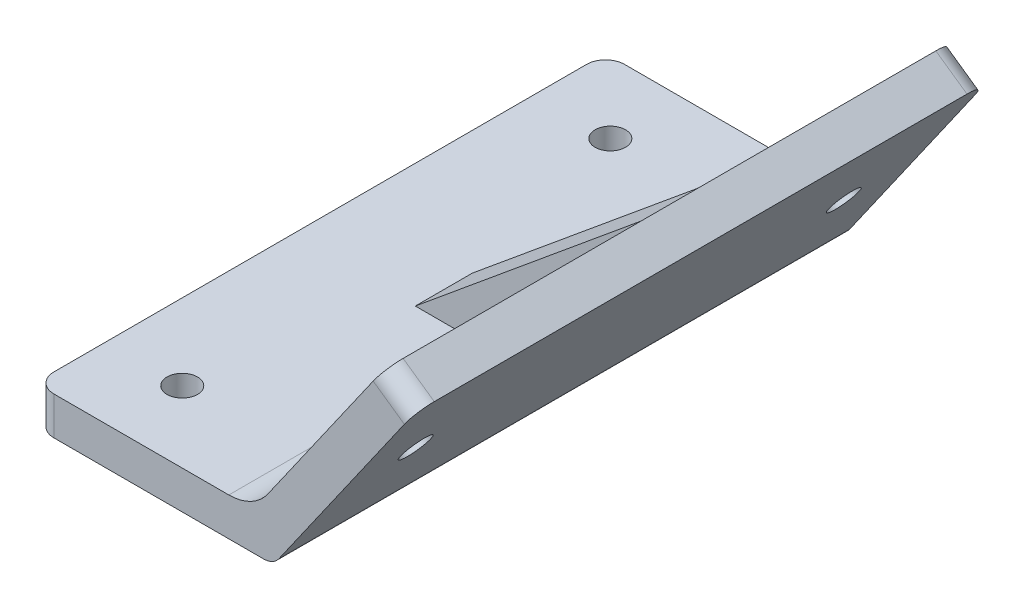
ISO-10303-21;
HEADER;
FILE_DESCRIPTION(('STEP AP214'),'2;1');
FILE_NAME('part.step','',(''),(''),'','','');
FILE_SCHEMA(('AUTOMOTIVE_DESIGN { 1 0 10303 214 1 1 1 1 }'));
ENDSEC;
DATA;
#1=APPLICATION_CONTEXT('core data for automotive mechanical design processes');
#2=APPLICATION_PROTOCOL_DEFINITION('international standard','automotive_design',2000,#1);
#3=PRODUCT_CONTEXT('',#1,'mechanical');
#4=PRODUCT('Part','Part','',(#3));
#5=PRODUCT_RELATED_PRODUCT_CATEGORY('part','',(#4));
#6=PRODUCT_DEFINITION_FORMATION('','',#4);
#7=PRODUCT_DEFINITION_CONTEXT('part definition',#1,'design');
#8=PRODUCT_DEFINITION('design','',#6,#7);
#9=PRODUCT_DEFINITION_SHAPE('','',#8);
#10=(LENGTH_UNIT() NAMED_UNIT(*) SI_UNIT(.MILLI.,.METRE.));
#11=(NAMED_UNIT(*) PLANE_ANGLE_UNIT() SI_UNIT($,.RADIAN.));
#12=(NAMED_UNIT(*) SI_UNIT($,.STERADIAN.) SOLID_ANGLE_UNIT());
#13=UNCERTAINTY_MEASURE_WITH_UNIT(LENGTH_MEASURE(1.E-05),#10,'distance_accuracy_value','');
#14=(GEOMETRIC_REPRESENTATION_CONTEXT(3) GLOBAL_UNCERTAINTY_ASSIGNED_CONTEXT((#13)) GLOBAL_UNIT_ASSIGNED_CONTEXT((#10,
#11,#12)) REPRESENTATION_CONTEXT('',''));
#15=CARTESIAN_POINT('',(0.,0.,0.));
#16=DIRECTION('',(0.,0.,1.));
#17=DIRECTION('',(1.,0.,0.));
#18=AXIS2_PLACEMENT_3D('',#15,#16,#17);
#19=CARTESIAN_POINT('',(6.07831173554464,-4.25607969681687,30.));
#20=DIRECTION('',(0.819152044288993,-0.573576436351044,0.));
#21=DIRECTION('',(0.573576436351044,0.819152044288993,0.));
#22=AXIS2_PLACEMENT_3D('',#19,#20,#21);
#23=PLANE('',#22);
#24=CARTESIAN_POINT('',(16.7210195965111,10.9432823211611,-22.5));
#25=DIRECTION('',(0.819152044288993,-0.573576436351044,0.));
#26=DIRECTION('',(0.573576436351044,0.819152044288993,0.));
#27=AXIS2_PLACEMENT_3D('',#24,#25,#26);
#28=CIRCLE('',#27,1.6);
#29=CARTESIAN_POINT('',(17.6387418946728,12.2539255920235,-22.5));
#30=VERTEX_POINT('',#29);
#31=EDGE_CURVE('E535',#30,#30,#28,.T.);
#32=ORIENTED_EDGE('',*,*,#31,.T.);
#33=EDGE_LOOP('',(#32));
#34=FACE_BOUND('',#33,.T.);
#35=DIRECTION('',(0.,0.,-1.));
#36=VECTOR('',#35,1.);
#37=CARTESIAN_POINT('',(24.1775132690747,21.592258896918,30.));
#38=LINE('',#37,#36);
#39=CARTESIAN_POINT('',(24.1775132690747,21.592258896918,-3.));
#40=VERTEX_POINT('',#39);
#41=CARTESIAN_POINT('',(24.1775132690747,21.592258896918,-28.));
#42=VERTEX_POINT('',#41);
#43=EDGE_CURVE('E213',#40,#42,#38,.T.);
#44=ORIENTED_EDGE('',*,*,#43,.T.);
#45=CARTESIAN_POINT('',(23.0303603963726,19.95395480834,-28.));
#46=DIRECTION('',(0.819152044288993,-0.573576436351044,0.));
#47=DIRECTION('',(0.573576436351044,0.819152044288993,0.));
#48=AXIS2_PLACEMENT_3D('',#45,#46,#47);
#49=CIRCLE('',#48,2.);
#50=CARTESIAN_POINT('',(23.0303603963726,19.95395480834,-30.));
#51=VERTEX_POINT('',#50);
#52=EDGE_CURVE('E240',#42,#51,#49,.F.);
#53=ORIENTED_EDGE('',*,*,#52,.T.);
#54=DIRECTION('',(-0.573576436351044,-0.819152044288993,0.));
#55=VECTOR('',#54,1.);
#56=CARTESIAN_POINT('',(6.07831173554464,-4.25607969681687,-30.));
#57=LINE('',#56,#55);
#58=CARTESIAN_POINT('',(11.9517908675827,4.13211781824478,-30.));
#59=VERTEX_POINT('',#58);
#60=EDGE_CURVE('E169',#51,#59,#57,.T.);
#61=ORIENTED_EDGE('',*,*,#60,.T.);
#62=DIRECTION('',(0.,0.,-1.));
#63=VECTOR('',#62,1.);
#64=CARTESIAN_POINT('',(11.9517908675827,4.13211781824478,30.));
#65=LINE('',#64,#63);
#66=CARTESIAN_POINT('',(11.9517908675827,4.13211781824478,-3.));
#67=VERTEX_POINT('',#66);
#68=EDGE_CURVE('E225',#59,#67,#65,.F.);
#69=ORIENTED_EDGE('',*,*,#68,.T.);
#70=DIRECTION('',(-0.573576436351043,-0.819152044288994,0.));
#71=VECTOR('',#70,1.);
#72=CARTESIAN_POINT('',(6.07831173554464,-4.25607969681687,-3.));
#73=LINE('',#72,#71);
#74=EDGE_CURVE('E158',#40,#67,#73,.T.);
#75=ORIENTED_EDGE('',*,*,#74,.F.);
#76=EDGE_LOOP('',(#44,#53,#61,#69,#75));
#77=FACE_BOUND('',#76,.T.);
#78=ADVANCED_FACE('F34',(#34,#77),#23,.F.);
#79=CARTESIAN_POINT('',(0.,2.,30.));
#80=DIRECTION('',(0.,1.,0.));
#81=DIRECTION('',(0.,0.,1.));
#82=AXIS2_PLACEMENT_3D('',#79,#80,#81);
#83=PLANE('',#82);
#84=CARTESIAN_POINT('',(-4.54113410110349,2.,22.5));
#85=DIRECTION('',(0.,1.,0.));
#86=DIRECTION('',(0.,0.,1.));
#87=AXIS2_PLACEMENT_3D('',#84,#85,#86);
#88=CIRCLE('',#87,1.6);
#89=CARTESIAN_POINT('',(-4.54113410110349,2.,24.1));
#90=VERTEX_POINT('',#89);
#91=EDGE_CURVE('E549',#90,#90,#88,.T.);
#92=ORIENTED_EDGE('',*,*,#91,.F.);
#93=EDGE_LOOP('',(#92));
#94=FACE_BOUND('',#93,.T.);
#95=CARTESIAN_POINT('',(-4.5411341011035,2.,-22.5));
#96=DIRECTION('',(0.,1.,0.));
#97=DIRECTION('',(0.,0.,1.));
#98=AXIS2_PLACEMENT_3D('',#95,#96,#97);
#99=CIRCLE('',#98,1.6);
#100=CARTESIAN_POINT('',(-4.5411341011035,2.,-20.9));
#101=VERTEX_POINT('',#100);
#102=EDGE_CURVE('E543',#101,#101,#99,.T.);
#103=ORIENTED_EDGE('',*,*,#102,.F.);
#104=EDGE_LOOP('',(#103));
#105=FACE_BOUND('',#104,.T.);
#106=DIRECTION('',(1.,0.,0.));
#107=VECTOR('',#106,1.);
#108=CARTESIAN_POINT('',(0.,2.,-30.));
#109=LINE('',#108,#107);
#110=CARTESIAN_POINT('',(-10.5411341011035,2.,-30.));
#111=VERTEX_POINT('',#110);
#112=CARTESIAN_POINT('',(7.85603064613776,2.,-30.));
#113=VERTEX_POINT('',#112);
#114=EDGE_CURVE('E188',#111,#113,#109,.T.);
#115=ORIENTED_EDGE('',*,*,#114,.F.);
#116=CARTESIAN_POINT('',(-10.5411341011035,2.,-28.));
#117=DIRECTION('',(0.,1.,0.));
#118=DIRECTION('',(0.,0.,1.));
#119=AXIS2_PLACEMENT_3D('',#116,#117,#118);
#120=CIRCLE('',#119,2.);
#121=CARTESIAN_POINT('',(-12.5411341011035,2.,-28.));
#122=VERTEX_POINT('',#121);
#123=EDGE_CURVE('E42',#111,#122,#120,.T.);
#124=ORIENTED_EDGE('',*,*,#123,.T.);
#125=DIRECTION('',(0.,0.,-1.));
#126=VECTOR('',#125,1.);
#127=CARTESIAN_POINT('',(-12.5411341011035,2.,30.));
#128=LINE('',#127,#126);
#129=CARTESIAN_POINT('',(-12.5411341011035,2.,28.));
#130=VERTEX_POINT('',#129);
#131=EDGE_CURVE('E210',#130,#122,#128,.T.);
#132=ORIENTED_EDGE('',*,*,#131,.F.);
#133=CARTESIAN_POINT('',(-10.5411341011035,2.,28.));
#134=DIRECTION('',(0.,1.,0.));
#135=DIRECTION('',(0.,0.,1.));
#136=AXIS2_PLACEMENT_3D('',#133,#134,#135);
#137=CIRCLE('',#136,2.);
#138=CARTESIAN_POINT('',(-10.5411341011035,2.,30.));
#139=VERTEX_POINT('',#138);
#140=EDGE_CURVE('E49',#130,#139,#137,.T.);
#141=ORIENTED_EDGE('',*,*,#140,.T.);
#142=DIRECTION('',(1.,0.,0.));
#143=VECTOR('',#142,1.);
#144=CARTESIAN_POINT('',(0.,2.,30.));
#145=LINE('',#144,#143);
#146=CARTESIAN_POINT('',(7.85603064613776,2.,30.));
#147=VERTEX_POINT('',#146);
#148=EDGE_CURVE('E197',#139,#147,#145,.T.);
#149=ORIENTED_EDGE('',*,*,#148,.T.);
#150=DIRECTION('',(0.,0.,-1.));
#151=VECTOR('',#150,1.);
#152=CARTESIAN_POINT('',(7.85603064613776,2.,30.));
#153=LINE('',#152,#151);
#154=CARTESIAN_POINT('',(7.85603064613776,2.,3.));
#155=VERTEX_POINT('',#154);
#156=EDGE_CURVE('E155',#147,#155,#153,.T.);
#157=ORIENTED_EDGE('',*,*,#156,.T.);
#158=DIRECTION('',(1.,0.,0.));
#159=VECTOR('',#158,1.);
#160=CARTESIAN_POINT('',(0.,2.,3.));
#161=LINE('',#160,#159);
#162=CARTESIAN_POINT('',(0.458865898896504,2.,3.));
#163=VERTEX_POINT('',#162);
#164=EDGE_CURVE('E148',#163,#155,#161,.T.);
#165=ORIENTED_EDGE('',*,*,#164,.F.);
#166=DIRECTION('',(0.,0.,1.));
#167=VECTOR('',#166,1.);
#168=CARTESIAN_POINT('',(0.458865898896504,2.,-3.));
#169=LINE('',#168,#167);
#170=CARTESIAN_POINT('',(0.4588658988965,2.,-3.));
#171=VERTEX_POINT('',#170);
#172=EDGE_CURVE('E152',#171,#163,#169,.T.);
#173=ORIENTED_EDGE('',*,*,#172,.F.);
#174=DIRECTION('',(1.,0.,0.));
#175=VECTOR('',#174,1.);
#176=CARTESIAN_POINT('',(0.,2.,-3.));
#177=LINE('',#176,#175);
#178=CARTESIAN_POINT('',(7.85603064613776,2.,-3.));
#179=VERTEX_POINT('',#178);
#180=EDGE_CURVE('E183',#171,#179,#177,.T.);
#181=ORIENTED_EDGE('',*,*,#180,.T.);
#182=DIRECTION('',(0.,0.,-1.));
#183=VECTOR('',#182,1.);
#184=CARTESIAN_POINT('',(7.85603064613776,2.,30.));
#185=LINE('',#184,#183);
#186=EDGE_CURVE('E216',#179,#113,#185,.T.);
#187=ORIENTED_EDGE('',*,*,#186,.T.);
#188=EDGE_LOOP('',(#115,#124,#132,#141,#149,#157,#165,#173,#181,#187));
#189=FACE_BOUND('',#188,.T.);
#190=ADVANCED_FACE('F150',(#94,#105,#189),#83,.T.);
#191=CARTESIAN_POINT('',(18.09920153353,25.8483385937349,30.));
#192=DIRECTION('',(-0.573576436351044,-0.819152044288993,0.));
#193=DIRECTION('',(0.819152044288994,-0.573576436351044,0.));
#194=AXIS2_PLACEMENT_3D('',#191,#192,#193);
#195=PLANE('',#194);
#196=DIRECTION('',(0.,0.,-1.));
#197=VECTOR('',#196,1.);
#198=CARTESIAN_POINT('',(27.4541214462306,19.2979531515138,30.));
#199=LINE('',#198,#197);
#200=CARTESIAN_POINT('',(27.4541214462306,19.2979531515138,28.));
#201=VERTEX_POINT('',#200);
#202=CARTESIAN_POINT('',(27.4541214462306,19.2979531515138,-28.));
#203=VERTEX_POINT('',#202);
#204=EDGE_CURVE('E204',#201,#203,#199,.T.);
#205=ORIENTED_EDGE('',*,*,#204,.T.);
#206=DIRECTION('',(-0.819152044288994,0.573576436351044,0.));
#207=VECTOR('',#206,1.);
#208=CARTESIAN_POINT('',(18.09920153353,25.8483385937349,-28.));
#209=LINE('',#208,#207);
#210=EDGE_CURVE('E237',#203,#42,#209,.T.);
#211=ORIENTED_EDGE('',*,*,#210,.T.);
#212=ORIENTED_EDGE('',*,*,#43,.F.);
#213=DIRECTION('',(0.,0.,1.));
#214=VECTOR('',#213,1.);
#215=CARTESIAN_POINT('',(24.1775132690747,21.592258896918,-3.));
#216=LINE('',#215,#214);
#217=CARTESIAN_POINT('',(24.1775132690747,21.592258896918,3.));
#218=VERTEX_POINT('',#217);
#219=EDGE_CURVE('E170',#40,#218,#216,.T.);
#220=ORIENTED_EDGE('',*,*,#219,.T.);
#221=CARTESIAN_POINT('',(24.1775132690747,21.592258896918,28.));
#222=VERTEX_POINT('',#221);
#223=EDGE_CURVE('E214',#222,#218,#38,.T.);
#224=ORIENTED_EDGE('',*,*,#223,.F.);
#225=DIRECTION('',(-0.819152044288994,0.573576436351044,0.));
#226=VECTOR('',#225,1.);
#227=CARTESIAN_POINT('',(27.4541214462306,19.2979531515138,28.));
#228=LINE('',#227,#226);
#229=EDGE_CURVE('E235',#222,#201,#228,.F.);
#230=ORIENTED_EDGE('',*,*,#229,.T.);
#231=EDGE_LOOP('',(#205,#211,#212,#220,#224,#230));
#232=FACE_BOUND('',#231,.T.);
#233=ADVANCED_FACE('F308',(#232),#195,.F.);
#234=CARTESIAN_POINT('',(16.7210195965111,10.9432823211611,22.5));
#235=DIRECTION('',(0.819152044288993,-0.573576436351044,0.));
#236=DIRECTION('',(0.573576436351044,0.819152044288993,0.));
#237=AXIS2_PLACEMENT_3D('',#234,#235,#236);
#238=CIRCLE('',#237,1.6);
#239=CARTESIAN_POINT('',(17.6387418946728,12.2539255920235,22.5));
#240=VERTEX_POINT('',#239);
#241=EDGE_CURVE('E176',#240,#240,#238,.T.);
#242=ORIENTED_EDGE('',*,*,#241,.T.);
#243=EDGE_LOOP('',(#242));
#244=FACE_BOUND('',#243,.T.);
#245=DIRECTION('',(-0.573576436351044,-0.819152044288993,0.));
#246=VECTOR('',#245,1.);
#247=CARTESIAN_POINT('',(6.07831173554464,-4.25607969681687,30.));
#248=LINE('',#247,#246);
#249=CARTESIAN_POINT('',(23.0303603963726,19.95395480834,30.));
#250=VERTEX_POINT('',#249);
#251=CARTESIAN_POINT('',(11.9517908675827,4.13211781824478,30.));
#252=VERTEX_POINT('',#251);
#253=EDGE_CURVE('E195',#250,#252,#248,.T.);
#254=ORIENTED_EDGE('',*,*,#253,.F.);
#255=CARTESIAN_POINT('',(23.0303603963726,19.95395480834,28.));
#256=DIRECTION('',(0.819152044288993,-0.573576436351044,0.));
#257=DIRECTION('',(0.573576436351044,0.819152044288993,0.));
#258=AXIS2_PLACEMENT_3D('',#255,#256,#257);
#259=CIRCLE('',#258,2.);
#260=EDGE_CURVE('E259',#250,#222,#259,.F.);
#261=ORIENTED_EDGE('',*,*,#260,.T.);
#262=ORIENTED_EDGE('',*,*,#223,.T.);
#263=DIRECTION('',(-0.573576436351043,-0.819152044288994,0.));
#264=VECTOR('',#263,1.);
#265=CARTESIAN_POINT('',(6.07831173554464,-4.25607969681687,3.));
#266=LINE('',#265,#264);
#267=CARTESIAN_POINT('',(11.9517908675827,4.13211781824478,3.));
#268=VERTEX_POINT('',#267);
#269=EDGE_CURVE('E174',#218,#268,#266,.T.);
#270=ORIENTED_EDGE('',*,*,#269,.T.);
#271=DIRECTION('',(0.,0.,-1.));
#272=VECTOR('',#271,1.);
#273=CARTESIAN_POINT('',(11.9517908675827,4.13211781824478,30.));
#274=LINE('',#273,#272);
#275=EDGE_CURVE('E222',#268,#252,#274,.F.);
#276=ORIENTED_EDGE('',*,*,#275,.T.);
#277=EDGE_LOOP('',(#254,#261,#262,#270,#276));
#278=FACE_BOUND('',#277,.T.);
#279=ADVANCED_FACE('F304',(#244,#278),#23,.F.);
#280=CARTESIAN_POINT('',(-12.5411341011035,0.,30.));
#281=DIRECTION('',(1.,0.,0.));
#282=DIRECTION('',(0.,0.,-1.));
#283=AXIS2_PLACEMENT_3D('',#280,#281,#282);
#284=PLANE('',#283);
#285=ORIENTED_EDGE('',*,*,#131,.T.);
#286=DIRECTION('',(0.,-1.,0.));
#287=VECTOR('',#286,1.);
#288=CARTESIAN_POINT('',(-12.5411341011035,0.,-28.));
#289=LINE('',#288,#287);
#290=CARTESIAN_POINT('',(-12.5411341011035,-2.,-28.));
#291=VERTEX_POINT('',#290);
#292=EDGE_CURVE('E266',#122,#291,#289,.T.);
#293=ORIENTED_EDGE('',*,*,#292,.T.);
#294=DIRECTION('',(0.,0.,-1.));
#295=VECTOR('',#294,1.);
#296=CARTESIAN_POINT('',(-12.5411341011035,-2.,30.));
#297=LINE('',#296,#295);
#298=CARTESIAN_POINT('',(-12.5411341011035,-2.,28.));
#299=VERTEX_POINT('',#298);
#300=EDGE_CURVE('E207',#299,#291,#297,.T.);
#301=ORIENTED_EDGE('',*,*,#300,.F.);
#302=DIRECTION('',(0.,-1.,0.));
#303=VECTOR('',#302,1.);
#304=CARTESIAN_POINT('',(-12.5411341011035,2.,28.));
#305=LINE('',#304,#303);
#306=EDGE_CURVE('E264',#299,#130,#305,.F.);
#307=ORIENTED_EDGE('',*,*,#306,.T.);
#308=EDGE_LOOP('',(#285,#293,#301,#307));
#309=FACE_BOUND('',#308,.T.);
#310=ADVANCED_FACE('F278',(#309),#284,.F.);
#311=CARTESIAN_POINT('',(0.,-2.,30.));
#312=DIRECTION('',(0.,1.,0.));
#313=DIRECTION('',(0.,0.,1.));
#314=AXIS2_PLACEMENT_3D('',#311,#312,#313);
#315=PLANE('',#314);
#316=CARTESIAN_POINT('',(-4.54113410110349,-2.,22.5));
#317=DIRECTION('',(0.,1.,0.));
#318=DIRECTION('',(0.,0.,1.));
#319=AXIS2_PLACEMENT_3D('',#316,#317,#318);
#320=CIRCLE('',#319,1.6);
#321=CARTESIAN_POINT('',(-4.54113410110349,-2.,24.1));
#322=VERTEX_POINT('',#321);
#323=EDGE_CURVE('E546',#322,#322,#320,.T.);
#324=ORIENTED_EDGE('',*,*,#323,.T.);
#325=EDGE_LOOP('',(#324));
#326=FACE_BOUND('',#325,.T.);
#327=CARTESIAN_POINT('',(-4.5411341011035,-2.,-22.5));
#328=DIRECTION('',(0.,1.,0.));
#329=DIRECTION('',(0.,0.,1.));
#330=AXIS2_PLACEMENT_3D('',#327,#328,#329);
#331=CIRCLE('',#330,1.6);
#332=CARTESIAN_POINT('',(-4.5411341011035,-2.,-20.9));
#333=VERTEX_POINT('',#332);
#334=EDGE_CURVE('E542',#333,#333,#331,.T.);
#335=ORIENTED_EDGE('',*,*,#334,.T.);
#336=EDGE_LOOP('',(#335));
#337=FACE_BOUND('',#336,.T.);
#338=ORIENTED_EDGE('',*,*,#300,.T.);
#339=CARTESIAN_POINT('',(-10.5411341011035,-2.,-28.));
#340=DIRECTION('',(0.,1.,0.));
#341=DIRECTION('',(0.,0.,1.));
#342=AXIS2_PLACEMENT_3D('',#339,#340,#341);
#343=CIRCLE('',#342,2.);
#344=CARTESIAN_POINT('',(-10.5411341011035,-2.,-30.));
#345=VERTEX_POINT('',#344);
#346=EDGE_CURVE('E271',#291,#345,#343,.F.);
#347=ORIENTED_EDGE('',*,*,#346,.T.);
#348=DIRECTION('',(1.,0.,0.));
#349=VECTOR('',#348,1.);
#350=CARTESIAN_POINT('',(0.,-2.,-30.));
#351=LINE('',#350,#349);
#352=CARTESIAN_POINT('',(11.5,-2.,-30.));
#353=VERTEX_POINT('',#352);
#354=EDGE_CURVE('E190',#345,#353,#351,.T.);
#355=ORIENTED_EDGE('',*,*,#354,.T.);
#356=DIRECTION('',(0.,0.,-1.));
#357=VECTOR('',#356,1.);
#358=CARTESIAN_POINT('',(11.5,-2.,30.));
#359=LINE('',#358,#357);
#360=CARTESIAN_POINT('',(11.5,-2.,30.));
#361=VERTEX_POINT('',#360);
#362=EDGE_CURVE('E261',#353,#361,#359,.F.);
#363=ORIENTED_EDGE('',*,*,#362,.T.);
#364=DIRECTION('',(1.,0.,0.));
#365=VECTOR('',#364,1.);
#366=CARTESIAN_POINT('',(0.,-2.,30.));
#367=LINE('',#366,#365);
#368=CARTESIAN_POINT('',(-10.5411341011035,-2.,30.));
#369=VERTEX_POINT('',#368);
#370=EDGE_CURVE('E199',#369,#361,#367,.T.);
#371=ORIENTED_EDGE('',*,*,#370,.F.);
#372=CARTESIAN_POINT('',(-10.5411341011035,-2.,28.));
#373=DIRECTION('',(0.,1.,0.));
#374=DIRECTION('',(0.,0.,1.));
#375=AXIS2_PLACEMENT_3D('',#372,#373,#374);
#376=CIRCLE('',#375,2.);
#377=EDGE_CURVE('E269',#369,#299,#376,.F.);
#378=ORIENTED_EDGE('',*,*,#377,.T.);
#379=EDGE_LOOP('',(#338,#347,#355,#363,#371,#378));
#380=FACE_BOUND('',#379,.T.);
#381=ADVANCED_FACE('F283',(#326,#337,#380),#315,.F.);
#382=CARTESIAN_POINT('',(9.35491991270061,-6.55038544222105,30.));
#383=DIRECTION('',(-0.819152044288993,0.573576436351044,0.));
#384=DIRECTION('',(-0.573576436351044,-0.819152044288993,0.));
#385=AXIS2_PLACEMENT_3D('',#382,#383,#384);
#386=PLANE('',#385);
#387=CARTESIAN_POINT('',(19.9976277736671,8.64897657575692,-22.5));
#388=DIRECTION('',(0.819152044288993,-0.573576436351044,0.));
#389=DIRECTION('',(0.573576436351044,0.819152044288993,0.));
#390=AXIS2_PLACEMENT_3D('',#387,#388,#389);
#391=CIRCLE('',#390,1.6);
#392=CARTESIAN_POINT('',(20.9153500718287,9.95961984661931,-22.5));
#393=VERTEX_POINT('',#392);
#394=EDGE_CURVE('E539',#393,#393,#391,.T.);
#395=ORIENTED_EDGE('',*,*,#394,.F.);
#396=EDGE_LOOP('',(#395));
#397=FACE_BOUND('',#396,.T.);
#398=CARTESIAN_POINT('',(19.9976277736671,8.64897657575692,22.5));
#399=DIRECTION('',(0.819152044288993,-0.573576436351044,0.));
#400=DIRECTION('',(0.573576436351044,0.819152044288993,0.));
#401=AXIS2_PLACEMENT_3D('',#398,#399,#400);
#402=CIRCLE('',#401,1.6);
#403=CARTESIAN_POINT('',(20.9153500718287,9.95961984661931,22.5));
#404=VERTEX_POINT('',#403);
#405=EDGE_CURVE('E534',#404,#404,#402,.T.);
#406=ORIENTED_EDGE('',*,*,#405,.F.);
#407=EDGE_LOOP('',(#406));
#408=FACE_BOUND('',#407,.T.);
#409=DIRECTION('',(0.573576436351044,0.819152044288993,0.));
#410=VECTOR('',#409,1.);
#411=CARTESIAN_POINT('',(9.35491991270061,-6.55038544222105,-30.));
#412=LINE('',#411,#410);
#413=CARTESIAN_POINT('',(13.138304088578,-1.14715287270209,-30.));
#414=VERTEX_POINT('',#413);
#415=CARTESIAN_POINT('',(26.3069685735285,17.6596490629358,-30.));
#416=VERTEX_POINT('',#415);
#417=EDGE_CURVE('E192',#414,#416,#412,.T.);
#418=ORIENTED_EDGE('',*,*,#417,.T.);
#419=CARTESIAN_POINT('',(26.3069685735286,17.6596490629358,-28.));
#420=DIRECTION('',(-0.819152044288993,0.573576436351044,0.));
#421=DIRECTION('',(-0.573576436351044,-0.819152044288993,0.));
#422=AXIS2_PLACEMENT_3D('',#419,#420,#421);
#423=CIRCLE('',#422,2.);
#424=EDGE_CURVE('E252',#416,#203,#423,.F.);
#425=ORIENTED_EDGE('',*,*,#424,.T.);
#426=ORIENTED_EDGE('',*,*,#204,.F.);
#427=CARTESIAN_POINT('',(26.3069685735286,17.6596490629359,28.));
#428=DIRECTION('',(-0.819152044288993,0.573576436351044,0.));
#429=DIRECTION('',(-0.573576436351044,-0.819152044288993,0.));
#430=AXIS2_PLACEMENT_3D('',#427,#428,#429);
#431=CIRCLE('',#430,2.);
#432=CARTESIAN_POINT('',(26.3069685735286,17.6596490629359,30.));
#433=VERTEX_POINT('',#432);
#434=EDGE_CURVE('E250',#201,#433,#431,.F.);
#435=ORIENTED_EDGE('',*,*,#434,.T.);
#436=DIRECTION('',(0.573576436351044,0.819152044288993,0.));
#437=VECTOR('',#436,1.);
#438=CARTESIAN_POINT('',(9.35491991270061,-6.55038544222105,30.));
#439=LINE('',#438,#437);
#440=CARTESIAN_POINT('',(13.138304088578,-1.14715287270209,30.));
#441=VERTEX_POINT('',#440);
#442=EDGE_CURVE('E201',#441,#433,#439,.T.);
#443=ORIENTED_EDGE('',*,*,#442,.F.);
#444=DIRECTION('',(0.,0.,-1.));
#445=VECTOR('',#444,1.);
#446=CARTESIAN_POINT('',(13.138304088578,-1.14715287270209,30.));
#447=LINE('',#446,#445);
#448=EDGE_CURVE('E247',#441,#414,#447,.T.);
#449=ORIENTED_EDGE('',*,*,#448,.T.);
#450=EDGE_LOOP('',(#418,#425,#426,#435,#443,#449));
#451=FACE_BOUND('',#450,.T.);
#452=ADVANCED_FACE('F337',(#397,#408,#451),#386,.F.);
#453=CARTESIAN_POINT('',(0.,0.,30.));
#454=DIRECTION('',(0.,0.,1.));
#455=DIRECTION('',(1.,0.,0.));
#456=AXIS2_PLACEMENT_3D('',#453,#454,#455);
#457=PLANE('',#456);
#458=ORIENTED_EDGE('',*,*,#148,.F.);
#459=DIRECTION('',(0.,-1.,0.));
#460=VECTOR('',#459,1.);
#461=CARTESIAN_POINT('',(-10.5411341011035,-2.,30.));
#462=LINE('',#461,#460);
#463=EDGE_CURVE('E11',#139,#369,#462,.T.);
#464=ORIENTED_EDGE('',*,*,#463,.T.);
#465=ORIENTED_EDGE('',*,*,#370,.T.);
#466=CARTESIAN_POINT('',(11.5,0.,30.));
#467=DIRECTION('',(0.,0.,1.));
#468=DIRECTION('',(1.,0.,0.));
#469=AXIS2_PLACEMENT_3D('',#466,#467,#468);
#470=CIRCLE('',#469,2.);
#471=EDGE_CURVE('E254',#361,#441,#470,.T.);
#472=ORIENTED_EDGE('',*,*,#471,.T.);
#473=ORIENTED_EDGE('',*,*,#442,.T.);
#474=DIRECTION('',(-0.819152044288994,0.573576436351044,0.));
#475=VECTOR('',#474,1.);
#476=CARTESIAN_POINT('',(23.0303603963726,19.95395480834,30.));
#477=LINE('',#476,#475);
#478=EDGE_CURVE('E256',#433,#250,#477,.T.);
#479=ORIENTED_EDGE('',*,*,#478,.T.);
#480=ORIENTED_EDGE('',*,*,#253,.T.);
#481=CARTESIAN_POINT('',(7.85603064613776,7.,30.));
#482=DIRECTION('',(0.,0.,1.));
#483=DIRECTION('',(1.,0.,0.));
#484=AXIS2_PLACEMENT_3D('',#481,#482,#483);
#485=CIRCLE('',#484,5.);
#486=EDGE_CURVE('E229',#252,#147,#485,.F.);
#487=ORIENTED_EDGE('',*,*,#486,.T.);
#488=EDGE_LOOP('',(#458,#464,#465,#472,#473,#479,#480,#487));
#489=FACE_BOUND('',#488,.T.);
#490=ADVANCED_FACE('F293',(#489),#457,.T.);
#491=CARTESIAN_POINT('',(0.,0.,-30.));
#492=DIRECTION('',(0.,0.,1.));
#493=DIRECTION('',(1.,0.,0.));
#494=AXIS2_PLACEMENT_3D('',#491,#492,#493);
#495=PLANE('',#494);
#496=ORIENTED_EDGE('',*,*,#354,.F.);
#497=DIRECTION('',(0.,-1.,0.));
#498=VECTOR('',#497,1.);
#499=CARTESIAN_POINT('',(-10.5411341011035,0.,-30.));
#500=LINE('',#499,#498);
#501=EDGE_CURVE('E57',#345,#111,#500,.F.);
#502=ORIENTED_EDGE('',*,*,#501,.T.);
#503=ORIENTED_EDGE('',*,*,#114,.T.);
#504=CARTESIAN_POINT('',(7.85603064613776,7.,-30.));
#505=DIRECTION('',(0.,0.,1.));
#506=DIRECTION('',(1.,0.,0.));
#507=AXIS2_PLACEMENT_3D('',#504,#505,#506);
#508=CIRCLE('',#507,5.);
#509=EDGE_CURVE('E232',#113,#59,#508,.T.);
#510=ORIENTED_EDGE('',*,*,#509,.T.);
#511=ORIENTED_EDGE('',*,*,#60,.F.);
#512=DIRECTION('',(-0.819152044288994,0.573576436351044,0.));
#513=VECTOR('',#512,1.);
#514=CARTESIAN_POINT('',(16.9520486608279,24.2100345051569,-30.));
#515=LINE('',#514,#513);
#516=EDGE_CURVE('E245',#51,#416,#515,.F.);
#517=ORIENTED_EDGE('',*,*,#516,.T.);
#518=ORIENTED_EDGE('',*,*,#417,.F.);
#519=CARTESIAN_POINT('',(11.5,0.,-30.));
#520=DIRECTION('',(0.,0.,1.));
#521=DIRECTION('',(1.,0.,0.));
#522=AXIS2_PLACEMENT_3D('',#519,#520,#521);
#523=CIRCLE('',#522,2.);
#524=EDGE_CURVE('E242',#414,#353,#523,.F.);
#525=ORIENTED_EDGE('',*,*,#524,.T.);
#526=EDGE_LOOP('',(#496,#502,#503,#510,#511,#517,#518,#525));
#527=FACE_BOUND('',#526,.T.);
#528=ADVANCED_FACE('F284',(#527),#495,.F.);
#529=CARTESIAN_POINT('',(-0.795900787356845,0.963528004416772,-3.));
#530=DIRECTION('',(-0.636854275578976,0.770984196774991,0.));
#531=DIRECTION('',(-0.770984196774991,-0.636854275578976,0.));
#532=AXIS2_PLACEMENT_3D('',#529,#530,#531);
#533=PLANE('',#532);
#534=ORIENTED_EDGE('',*,*,#172,.T.);
#535=DIRECTION('',(-0.770984196774991,-0.636854275578976,0.));
#536=VECTOR('',#535,1.);
#537=CARTESIAN_POINT('',(-0.795900787356845,0.963528004416772,3.));
#538=LINE('',#537,#536);
#539=EDGE_CURVE('E159',#218,#163,#538,.T.);
#540=ORIENTED_EDGE('',*,*,#539,.F.);
#541=ORIENTED_EDGE('',*,*,#219,.F.);
#542=DIRECTION('',(-0.770984196774991,-0.636854275578976,0.));
#543=VECTOR('',#542,1.);
#544=CARTESIAN_POINT('',(-0.795900787356845,0.963528004416772,-3.));
#545=LINE('',#544,#543);
#546=EDGE_CURVE('E167',#40,#171,#545,.T.);
#547=ORIENTED_EDGE('',*,*,#546,.T.);
#548=EDGE_LOOP('',(#534,#540,#541,#547));
#549=FACE_BOUND('',#548,.T.);
#550=ADVANCED_FACE('F163',(#549),#533,.T.);
#551=CARTESIAN_POINT('',(0.,0.,-3.));
#552=DIRECTION('',(0.,0.,1.));
#553=DIRECTION('',(1.,0.,0.));
#554=AXIS2_PLACEMENT_3D('',#551,#552,#553);
#555=PLANE('',#554);
#556=ORIENTED_EDGE('',*,*,#74,.T.);
#557=CARTESIAN_POINT('',(7.85603064613776,7.,-3.));
#558=DIRECTION('',(0.,0.,1.));
#559=DIRECTION('',(1.,0.,0.));
#560=AXIS2_PLACEMENT_3D('',#557,#558,#559);
#561=CIRCLE('',#560,5.);
#562=EDGE_CURVE('E227',#67,#179,#561,.F.);
#563=ORIENTED_EDGE('',*,*,#562,.T.);
#564=ORIENTED_EDGE('',*,*,#180,.F.);
#565=ORIENTED_EDGE('',*,*,#546,.F.);
#566=EDGE_LOOP('',(#556,#563,#564,#565));
#567=FACE_BOUND('',#566,.T.);
#568=ADVANCED_FACE('F348',(#567),#555,.F.);
#569=CARTESIAN_POINT('',(0.,0.,3.));
#570=DIRECTION('',(0.,0.,1.));
#571=DIRECTION('',(1.,0.,0.));
#572=AXIS2_PLACEMENT_3D('',#569,#570,#571);
#573=PLANE('',#572);
#574=ORIENTED_EDGE('',*,*,#164,.T.);
#575=CARTESIAN_POINT('',(7.85603064613776,7.,3.));
#576=DIRECTION('',(0.,0.,1.));
#577=DIRECTION('',(1.,0.,0.));
#578=AXIS2_PLACEMENT_3D('',#575,#576,#577);
#579=CIRCLE('',#578,5.);
#580=EDGE_CURVE('E220',#155,#268,#579,.T.);
#581=ORIENTED_EDGE('',*,*,#580,.T.);
#582=ORIENTED_EDGE('',*,*,#269,.F.);
#583=ORIENTED_EDGE('',*,*,#539,.T.);
#584=EDGE_LOOP('',(#574,#581,#582,#583));
#585=FACE_BOUND('',#584,.T.);
#586=ADVANCED_FACE('F172',(#585),#573,.T.);
#587=CARTESIAN_POINT('',(-7.9175626067146,28.1954033106592,22.5));
#588=DIRECTION('',(0.819152044288993,-0.573576436351044,0.));
#589=DIRECTION('',(0.573576436351044,0.819152044288993,0.));
#590=AXIS2_PLACEMENT_3D('',#587,#588,#589);
#591=CYLINDRICAL_SURFACE('',#590,1.6);
#592=ORIENTED_EDGE('',*,*,#405,.T.);
#593=EDGE_LOOP('',(#592));
#594=FACE_BOUND('',#593,.T.);
#595=ORIENTED_EDGE('',*,*,#241,.F.);
#596=EDGE_LOOP('',(#595));
#597=FACE_BOUND('',#596,.T.);
#598=ADVANCED_FACE('F492',(#594,#597),#591,.F.);
#599=CARTESIAN_POINT('',(-7.9175626067146,28.1954033106592,-22.5));
#600=DIRECTION('',(0.819152044288993,-0.573576436351044,0.));
#601=DIRECTION('',(0.573576436351044,0.819152044288993,0.));
#602=AXIS2_PLACEMENT_3D('',#599,#600,#601);
#603=CYLINDRICAL_SURFACE('',#602,1.6);
#604=ORIENTED_EDGE('',*,*,#394,.T.);
#605=EDGE_LOOP('',(#604));
#606=FACE_BOUND('',#605,.T.);
#607=ORIENTED_EDGE('',*,*,#31,.F.);
#608=EDGE_LOOP('',(#607));
#609=FACE_BOUND('',#608,.T.);
#610=ADVANCED_FACE('F483',(#606,#609),#603,.F.);
#611=CARTESIAN_POINT('',(-4.5411341011035,-2.,-22.5));
#612=DIRECTION('',(0.,1.,0.));
#613=DIRECTION('',(0.,0.,1.));
#614=AXIS2_PLACEMENT_3D('',#611,#612,#613);
#615=CYLINDRICAL_SURFACE('',#614,1.6);
#616=ORIENTED_EDGE('',*,*,#334,.F.);
#617=EDGE_LOOP('',(#616));
#618=FACE_BOUND('',#617,.T.);
#619=ORIENTED_EDGE('',*,*,#102,.T.);
#620=EDGE_LOOP('',(#619));
#621=FACE_BOUND('',#620,.T.);
#622=ADVANCED_FACE('F473',(#618,#621),#615,.F.);
#623=CARTESIAN_POINT('',(-4.54113410110349,-2.,22.5));
#624=DIRECTION('',(0.,1.,0.));
#625=DIRECTION('',(0.,0.,1.));
#626=AXIS2_PLACEMENT_3D('',#623,#624,#625);
#627=CYLINDRICAL_SURFACE('',#626,1.6);
#628=ORIENTED_EDGE('',*,*,#323,.F.);
#629=EDGE_LOOP('',(#628));
#630=FACE_BOUND('',#629,.T.);
#631=ORIENTED_EDGE('',*,*,#91,.T.);
#632=EDGE_LOOP('',(#631));
#633=FACE_BOUND('',#632,.T.);
#634=ADVANCED_FACE('F361',(#630,#633),#627,.F.);
#635=CARTESIAN_POINT('',(7.85603064613776,7.,30.));
#636=DIRECTION('',(0.,0.,-1.));
#637=DIRECTION('',(-1.,0.,0.));
#638=AXIS2_PLACEMENT_3D('',#635,#636,#637);
#639=CYLINDRICAL_SURFACE('',#638,5.);
#640=ORIENTED_EDGE('',*,*,#486,.F.);
#641=ORIENTED_EDGE('',*,*,#275,.F.);
#642=ORIENTED_EDGE('',*,*,#580,.F.);
#643=ORIENTED_EDGE('',*,*,#156,.F.);
#644=EDGE_LOOP('',(#640,#641,#642,#643));
#645=FACE_BOUND('',#644,.T.);
#646=ADVANCED_FACE('F354',(#645),#639,.F.);
#647=CARTESIAN_POINT('',(7.85603064613776,7.,30.));
#648=DIRECTION('',(0.,0.,-1.));
#649=DIRECTION('',(-1.,0.,0.));
#650=AXIS2_PLACEMENT_3D('',#647,#648,#649);
#651=CYLINDRICAL_SURFACE('',#650,5.);
#652=ORIENTED_EDGE('',*,*,#562,.F.);
#653=ORIENTED_EDGE('',*,*,#68,.F.);
#654=ORIENTED_EDGE('',*,*,#509,.F.);
#655=ORIENTED_EDGE('',*,*,#186,.F.);
#656=EDGE_LOOP('',(#652,#653,#654,#655));
#657=FACE_BOUND('',#656,.T.);
#658=ADVANCED_FACE('F351',(#657),#651,.F.);
#659=CARTESIAN_POINT('',(16.9520486608279,24.2100345051569,-28.));
#660=DIRECTION('',(-0.819152044288994,0.573576436351044,0.));
#661=DIRECTION('',(-0.573576436351044,-0.819152044288993,0.));
#662=AXIS2_PLACEMENT_3D('',#659,#660,#661);
#663=CYLINDRICAL_SURFACE('',#662,2.);
#664=ORIENTED_EDGE('',*,*,#424,.F.);
#665=ORIENTED_EDGE('',*,*,#516,.F.);
#666=ORIENTED_EDGE('',*,*,#52,.F.);
#667=ORIENTED_EDGE('',*,*,#210,.F.);
#668=EDGE_LOOP('',(#664,#665,#666,#667));
#669=FACE_BOUND('',#668,.T.);
#670=ADVANCED_FACE('F341',(#669),#663,.T.);
#671=CARTESIAN_POINT('',(16.9520486608279,24.2100345051569,28.));
#672=DIRECTION('',(0.819152044288994,-0.573576436351044,0.));
#673=DIRECTION('',(0.573576436351044,0.819152044288993,0.));
#674=AXIS2_PLACEMENT_3D('',#671,#672,#673);
#675=CYLINDRICAL_SURFACE('',#674,2.);
#676=ORIENTED_EDGE('',*,*,#434,.F.);
#677=ORIENTED_EDGE('',*,*,#229,.F.);
#678=ORIENTED_EDGE('',*,*,#260,.F.);
#679=ORIENTED_EDGE('',*,*,#478,.F.);
#680=EDGE_LOOP('',(#676,#677,#678,#679));
#681=FACE_BOUND('',#680,.T.);
#682=ADVANCED_FACE('F332',(#681),#675,.T.);
#683=CARTESIAN_POINT('',(11.5,0.,30.));
#684=DIRECTION('',(0.,0.,-1.));
#685=DIRECTION('',(-1.,0.,0.));
#686=AXIS2_PLACEMENT_3D('',#683,#684,#685);
#687=CYLINDRICAL_SURFACE('',#686,2.);
#688=ORIENTED_EDGE('',*,*,#471,.F.);
#689=ORIENTED_EDGE('',*,*,#362,.F.);
#690=ORIENTED_EDGE('',*,*,#524,.F.);
#691=ORIENTED_EDGE('',*,*,#448,.F.);
#692=EDGE_LOOP('',(#688,#689,#690,#691));
#693=FACE_BOUND('',#692,.T.);
#694=ADVANCED_FACE('F290',(#693),#687,.T.);
#695=CARTESIAN_POINT('',(-10.5411341011035,0.,-28.));
#696=DIRECTION('',(0.,-1.,0.));
#697=DIRECTION('',(0.,0.,-1.));
#698=AXIS2_PLACEMENT_3D('',#695,#696,#697);
#699=CYLINDRICAL_SURFACE('',#698,2.);
#700=ORIENTED_EDGE('',*,*,#123,.F.);
#701=ORIENTED_EDGE('',*,*,#501,.F.);
#702=ORIENTED_EDGE('',*,*,#346,.F.);
#703=ORIENTED_EDGE('',*,*,#292,.F.);
#704=EDGE_LOOP('',(#700,#701,#702,#703));
#705=FACE_BOUND('',#704,.T.);
#706=ADVANCED_FACE('F281',(#705),#699,.T.);
#707=CARTESIAN_POINT('',(-10.5411341011035,0.,28.));
#708=DIRECTION('',(0.,1.,0.));
#709=DIRECTION('',(0.,0.,1.));
#710=AXIS2_PLACEMENT_3D('',#707,#708,#709);
#711=CYLINDRICAL_SURFACE('',#710,2.);
#712=ORIENTED_EDGE('',*,*,#140,.F.);
#713=ORIENTED_EDGE('',*,*,#306,.F.);
#714=ORIENTED_EDGE('',*,*,#377,.F.);
#715=ORIENTED_EDGE('',*,*,#463,.F.);
#716=EDGE_LOOP('',(#712,#713,#714,#715));
#717=FACE_BOUND('',#716,.T.);
#718=ADVANCED_FACE('F36',(#717),#711,.T.);
#719=CLOSED_SHELL('',(#78,#190,#233,#279,#310,#381,#452,#490,#528,#550,#568,#586,#598,#610,#622,
#634,#646,#658,#670,#682,#694,#706,#718));
#720=MANIFOLD_SOLID_BREP('B2',#719);
#721=ADVANCED_BREP_SHAPE_REPRESENTATION('',(#18,#720),#14);
#722=SHAPE_DEFINITION_REPRESENTATION(#9,#721);
ENDSEC;
END-ISO-10303-21;
